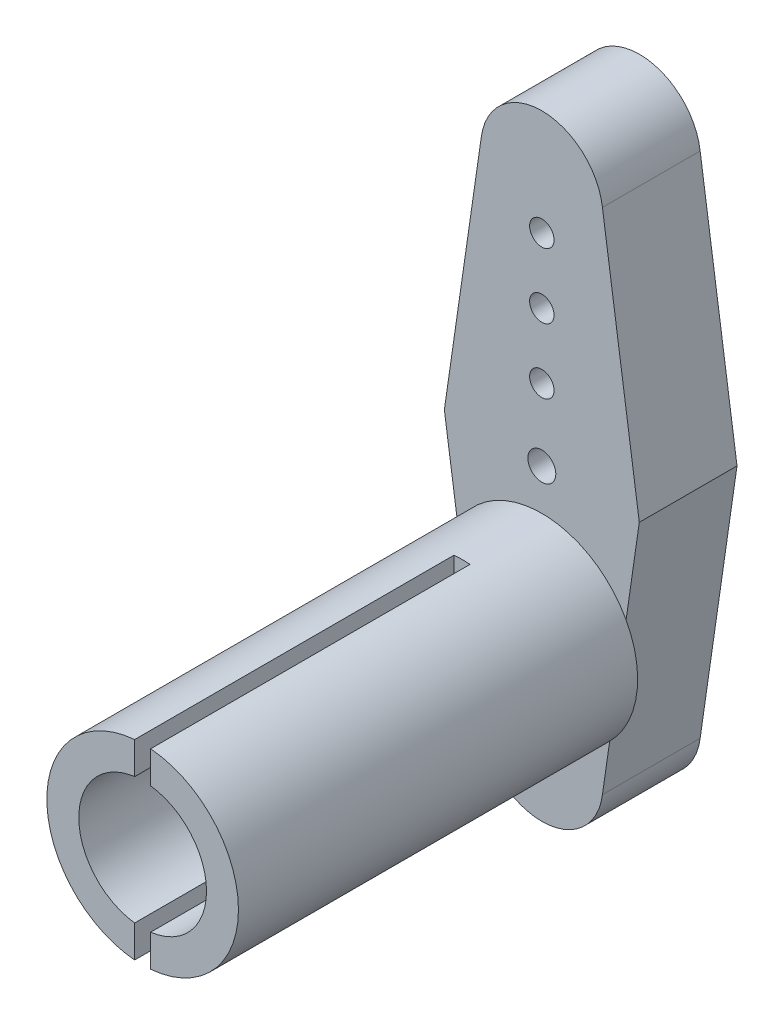
ISO-10303-21;
HEADER;
FILE_DESCRIPTION(('STEP AP214'),'2;1');
FILE_NAME('part.step','',(''),(''),'','','');
FILE_SCHEMA(('AUTOMOTIVE_DESIGN { 1 0 10303 214 1 1 1 1 }'));
ENDSEC;
DATA;
#1=APPLICATION_CONTEXT('core data for automotive mechanical design processes');
#2=APPLICATION_PROTOCOL_DEFINITION('international standard','automotive_design',2000,#1);
#3=PRODUCT_CONTEXT('',#1,'mechanical');
#4=PRODUCT('Part','Part','',(#3));
#5=PRODUCT_RELATED_PRODUCT_CATEGORY('part','',(#4));
#6=PRODUCT_DEFINITION_FORMATION('','',#4);
#7=PRODUCT_DEFINITION_CONTEXT('part definition',#1,'design');
#8=PRODUCT_DEFINITION('design','',#6,#7);
#9=PRODUCT_DEFINITION_SHAPE('','',#8);
#10=(LENGTH_UNIT() NAMED_UNIT(*) SI_UNIT(.MILLI.,.METRE.));
#11=(NAMED_UNIT(*) PLANE_ANGLE_UNIT() SI_UNIT($,.RADIAN.));
#12=(NAMED_UNIT(*) SI_UNIT($,.STERADIAN.) SOLID_ANGLE_UNIT());
#13=UNCERTAINTY_MEASURE_WITH_UNIT(LENGTH_MEASURE(1.E-05),#10,'distance_accuracy_value','');
#14=(GEOMETRIC_REPRESENTATION_CONTEXT(3) GLOBAL_UNCERTAINTY_ASSIGNED_CONTEXT((#13)) GLOBAL_UNIT_ASSIGNED_CONTEXT((#10,
#11,#12)) REPRESENTATION_CONTEXT('',''));
#15=CARTESIAN_POINT('',(0.,0.,0.));
#16=DIRECTION('',(0.,0.,1.));
#17=DIRECTION('',(1.,0.,0.));
#18=AXIS2_PLACEMENT_3D('',#15,#16,#17);
#19=CARTESIAN_POINT('',(-1.19664990586423E-09,-8.56204876477218,31.0513084455538));
#20=DIRECTION('',(0.,0.,1.));
#21=DIRECTION('',(1.,0.,0.));
#22=AXIS2_PLACEMENT_3D('',#19,#20,#21);
#23=PLANE('',#22);
#24=DIRECTION('',(0.,1.,0.));
#25=VECTOR('',#24,1.);
#26=CARTESIAN_POINT('',(0.499999999999995,-8.56204876477218,31.0513084455538));
#27=LINE('',#26,#25);
#28=CARTESIAN_POINT('',(0.499999999999995,-14.5411791362228,31.0513084455538));
#29=VERTEX_POINT('',#28);
#30=CARTESIAN_POINT('',(0.499999999999995,-12.5306757312183,31.0513084455538));
#31=VERTEX_POINT('',#30);
#32=EDGE_CURVE('E228',#29,#31,#27,.T.);
#33=ORIENTED_EDGE('',*,*,#32,.F.);
#34=CARTESIAN_POINT('',(-1.19664990586423E-09,-8.56204876477218,31.0513084455538));
#35=DIRECTION('',(0.,0.,1.));
#36=DIRECTION('',(1.,0.,0.));
#37=AXIS2_PLACEMENT_3D('',#34,#35,#36);
#38=CIRCLE('',#37,6.);
#39=CARTESIAN_POINT('',(0.499999999999995,-2.58291839332155,31.0513084455538));
#40=VERTEX_POINT('',#39);
#41=EDGE_CURVE('E225',#29,#40,#38,.T.);
#42=ORIENTED_EDGE('',*,*,#41,.T.);
#43=CARTESIAN_POINT('',(0.499999999999995,-4.59342179832606,31.0513084455538));
#44=VERTEX_POINT('',#43);
#45=EDGE_CURVE('E238',#44,#40,#27,.T.);
#46=ORIENTED_EDGE('',*,*,#45,.F.);
#47=CARTESIAN_POINT('',(-1.19664990586423E-09,-8.56204876477218,31.0513084455538));
#48=DIRECTION('',(0.,0.,1.));
#49=DIRECTION('',(1.,0.,0.));
#50=AXIS2_PLACEMENT_3D('',#47,#48,#49);
#51=CIRCLE('',#50,4.);
#52=EDGE_CURVE('E241',#31,#44,#51,.T.);
#53=ORIENTED_EDGE('',*,*,#52,.F.);
#54=EDGE_LOOP('',(#33,#42,#46,#53));
#55=FACE_BOUND('',#54,.T.);
#56=ADVANCED_FACE('F39',(#55),#23,.T.);
#57=CARTESIAN_POINT('',(-1.19664990586423E-09,0.107951235227818,6.05130844555376));
#58=DIRECTION('',(0.,0.,1.));
#59=DIRECTION('',(1.,0.,0.));
#60=AXIS2_PLACEMENT_3D('',#57,#58,#59);
#61=PLANE('',#60);
#62=CARTESIAN_POINT('',(-1.19664990586423E-09,-8.56204876477218,6.05130844555376));
#63=DIRECTION('',(0.,0.,1.));
#64=DIRECTION('',(1.,0.,0.));
#65=AXIS2_PLACEMENT_3D('',#62,#63,#64);
#66=CIRCLE('',#65,6.);
#67=CARTESIAN_POINT('',(5.27685124459652,-5.70638055404268,6.05130844555376));
#68=VERTEX_POINT('',#67);
#69=CARTESIAN_POINT('',(-5.27685118137984,-5.70638043280517,6.05130844555376));
#70=VERTEX_POINT('',#69);
#71=EDGE_CURVE('E252',#68,#70,#66,.T.);
#72=ORIENTED_EDGE('',*,*,#71,.F.);
#73=DIRECTION('',(0.143511087190295,0.989648709317331,0.));
#74=VECTOR('',#73,1.);
#75=CARTESIAN_POINT('',(6.11999999880335,0.107951235227818,6.05130844555376));
#76=LINE('',#75,#74);
#77=CARTESIAN_POINT('',(6.10434575807608,0.,6.05130844555376));
#78=VERTEX_POINT('',#77);
#79=EDGE_CURVE('E411',#68,#78,#76,.T.);
#80=ORIENTED_EDGE('',*,*,#79,.T.);
#81=DIRECTION('',(0.143511087190295,-0.989648709317331,0.));
#82=VECTOR('',#81,1.);
#83=CARTESIAN_POINT('',(6.11999999880335,-0.107951235227818,6.05130844555376));
#84=LINE('',#83,#82);
#85=CARTESIAN_POINT('',(3.79498273594539,15.9253070891053,6.05130844555376));
#86=VERTEX_POINT('',#85);
#87=EDGE_CURVE('E329',#86,#78,#84,.T.);
#88=ORIENTED_EDGE('',*,*,#87,.F.);
#89=CARTESIAN_POINT('',(-1.19664990586423E-09,15.4470487647722,6.05130844555376));
#90=DIRECTION('',(0.,0.,-1.));
#91=DIRECTION('',(1.,0.,0.));
#92=AXIS2_PLACEMENT_3D('',#89,#90,#91);
#93=CIRCLE('',#92,3.825);
#94=CARTESIAN_POINT('',(-3.79498426071311,15.9252950088999,6.05130844555376));
#95=VERTEX_POINT('',#94);
#96=EDGE_CURVE('E325',#95,#86,#93,.T.);
#97=ORIENTED_EDGE('',*,*,#96,.F.);
#98=DIRECTION('',(0.143511101058466,0.989648707306278,0.));
#99=VECTOR('',#98,1.);
#100=CARTESIAN_POINT('',(-6.12000000119665,-0.107951235227818,6.05130844555376));
#101=LINE('',#100,#99);
#102=CARTESIAN_POINT('',(-6.10434575892483,0.,6.05130844555376));
#103=VERTEX_POINT('',#102);
#104=EDGE_CURVE('E321',#103,#95,#101,.T.);
#105=ORIENTED_EDGE('',*,*,#104,.F.);
#106=DIRECTION('',(0.143511101058466,-0.989648707306278,0.));
#107=VECTOR('',#106,1.);
#108=CARTESIAN_POINT('',(-6.12000000119665,0.107951235227818,6.05130844555376));
#109=LINE('',#108,#107);
#110=EDGE_CURVE('E402',#103,#70,#109,.T.);
#111=ORIENTED_EDGE('',*,*,#110,.T.);
#112=EDGE_LOOP('',(#72,#80,#88,#97,#105,#111));
#113=FACE_BOUND('',#112,.T.);
#114=CARTESIAN_POINT('',(0.,0.,6.05130844555376));
#115=DIRECTION('',(0.,0.,1.));
#116=DIRECTION('',(1.,0.,0.));
#117=AXIS2_PLACEMENT_3D('',#114,#115,#116);
#118=CIRCLE('',#117,0.875);
#119=CARTESIAN_POINT('',(0.875,0.,6.05130844555376));
#120=VERTEX_POINT('',#119);
#121=EDGE_CURVE('E259',#120,#120,#118,.T.);
#122=ORIENTED_EDGE('',*,*,#121,.F.);
#123=EDGE_LOOP('',(#122));
#124=FACE_BOUND('',#123,.T.);
#125=CARTESIAN_POINT('',(-1.19664990586423E-09,8.56204876477218,6.05130844555376));
#126=DIRECTION('',(0.,0.,1.));
#127=DIRECTION('',(-1.,0.,0.));
#128=AXIS2_PLACEMENT_3D('',#125,#126,#127);
#129=CIRCLE('',#128,0.765);
#130=CARTESIAN_POINT('',(-0.76500000119665,8.56204876477218,6.05130844555376));
#131=VERTEX_POINT('',#130);
#132=EDGE_CURVE('E278',#131,#131,#129,.T.);
#133=ORIENTED_EDGE('',*,*,#132,.F.);
#134=EDGE_LOOP('',(#133));
#135=FACE_BOUND('',#134,.T.);
#136=CARTESIAN_POINT('',(-1.19664990586423E-09,4.48204876477218,6.05130844555376));
#137=DIRECTION('',(0.,0.,1.));
#138=DIRECTION('',(-1.,0.,0.));
#139=AXIS2_PLACEMENT_3D('',#136,#137,#138);
#140=CIRCLE('',#139,0.765);
#141=CARTESIAN_POINT('',(-0.76500000119665,4.48204876477218,6.05130844555376));
#142=VERTEX_POINT('',#141);
#143=EDGE_CURVE('E286',#142,#142,#140,.T.);
#144=ORIENTED_EDGE('',*,*,#143,.F.);
#145=EDGE_LOOP('',(#144));
#146=FACE_BOUND('',#145,.T.);
#147=CARTESIAN_POINT('',(-1.19664990586423E-09,12.6420487647722,6.05130844555376));
#148=DIRECTION('',(0.,0.,1.));
#149=DIRECTION('',(-1.,0.,0.));
#150=AXIS2_PLACEMENT_3D('',#147,#148,#149);
#151=CIRCLE('',#150,0.765);
#152=CARTESIAN_POINT('',(-0.76500000119665,12.6420487647722,6.05130844555376));
#153=VERTEX_POINT('',#152);
#154=EDGE_CURVE('E349',#153,#153,#151,.T.);
#155=ORIENTED_EDGE('',*,*,#154,.F.);
#156=EDGE_LOOP('',(#155));
#157=FACE_BOUND('',#156,.T.);
#158=ADVANCED_FACE('F539',(#113,#124,#135,#146,#157),#61,.T.);
#159=CARTESIAN_POINT('',(-1.19664990586423E-09,-8.56204876477218,6.05130844555376));
#160=DIRECTION('',(0.,0.,-1.));
#161=DIRECTION('',(-1.,0.,0.));
#162=AXIS2_PLACEMENT_3D('',#159,#160,#161);
#163=CIRCLE('',#162,0.765);
#164=CARTESIAN_POINT('',(-0.76500000119665,-8.56204876477218,6.05130844555376));
#165=VERTEX_POINT('',#164);
#166=EDGE_CURVE('E360',#165,#165,#163,.T.);
#167=ORIENTED_EDGE('',*,*,#166,.T.);
#168=EDGE_LOOP('',(#167));
#169=FACE_BOUND('',#168,.T.);
#170=CARTESIAN_POINT('',(-1.19664990586423E-09,-4.48204876477218,6.05130844555376));
#171=DIRECTION('',(0.,0.,-1.));
#172=DIRECTION('',(-1.,0.,0.));
#173=AXIS2_PLACEMENT_3D('',#170,#171,#172);
#174=CIRCLE('',#173,0.765);
#175=CARTESIAN_POINT('',(0.749962528498331,-4.63298320104669,6.05130844555376));
#176=VERTEX_POINT('',#175);
#177=CARTESIAN_POINT('',(-0.749962530891631,-4.63298320104669,6.05130844555376));
#178=VERTEX_POINT('',#177);
#179=EDGE_CURVE('E369',#176,#178,#174,.T.);
#180=ORIENTED_EDGE('',*,*,#179,.T.);
#181=CARTESIAN_POINT('',(-1.19664990586423E-09,-8.56204876477218,6.05130844555376));
#182=DIRECTION('',(0.,0.,1.));
#183=DIRECTION('',(1.,0.,0.));
#184=AXIS2_PLACEMENT_3D('',#181,#182,#183);
#185=CIRCLE('',#184,4.);
#186=CARTESIAN_POINT('',(-0.749962530891631,-12.4911143284977,6.05130844555376));
#187=VERTEX_POINT('',#186);
#188=EDGE_CURVE('E235',#178,#187,#185,.T.);
#189=ORIENTED_EDGE('',*,*,#188,.T.);
#190=CARTESIAN_POINT('',(-1.19664990586423E-09,-12.6420487647722,6.05130844555376));
#191=DIRECTION('',(0.,0.,-1.));
#192=DIRECTION('',(-1.,0.,0.));
#193=AXIS2_PLACEMENT_3D('',#190,#191,#192);
#194=CIRCLE('',#193,0.765);
#195=CARTESIAN_POINT('',(0.749962528498332,-12.4911143284977,6.05130844555376));
#196=VERTEX_POINT('',#195);
#197=EDGE_CURVE('E436',#187,#196,#194,.T.);
#198=ORIENTED_EDGE('',*,*,#197,.T.);
#199=EDGE_CURVE('E248',#196,#176,#185,.T.);
#200=ORIENTED_EDGE('',*,*,#199,.T.);
#201=EDGE_LOOP('',(#180,#189,#198,#200));
#202=FACE_BOUND('',#201,.T.);
#203=ADVANCED_FACE('F513',(#169,#202),#61,.T.);
#204=CARTESIAN_POINT('',(-1.19664990586423E-09,0.107951235227818,-0.0686915544462373));
#205=DIRECTION('',(0.,0.,1.));
#206=DIRECTION('',(1.,0.,0.));
#207=AXIS2_PLACEMENT_3D('',#204,#205,#206);
#208=PLANE('',#207);
#209=DIRECTION('',(0.143511101058466,-0.989648707306278,0.));
#210=VECTOR('',#209,1.);
#211=CARTESIAN_POINT('',(-6.12000000119665,0.107951235227818,-0.0686915544462373));
#212=LINE('',#211,#210);
#213=CARTESIAN_POINT('',(-6.10434575892483,0.,-0.0686915544462373));
#214=VERTEX_POINT('',#213);
#215=CARTESIAN_POINT('',(-3.79498426071311,-15.9252950088999,-0.0686915544462373));
#216=VERTEX_POINT('',#215);
#217=EDGE_CURVE('E401',#214,#216,#212,.T.);
#218=ORIENTED_EDGE('',*,*,#217,.F.);
#219=DIRECTION('',(0.143511101058466,0.989648707306278,0.));
#220=VECTOR('',#219,1.);
#221=CARTESIAN_POINT('',(-6.12000000119665,-0.107951235227818,-0.0686915544462373));
#222=LINE('',#221,#220);
#223=CARTESIAN_POINT('',(-3.79498426071311,15.9252950088999,-0.0686915544462373));
#224=VERTEX_POINT('',#223);
#225=EDGE_CURVE('E320',#214,#224,#222,.T.);
#226=ORIENTED_EDGE('',*,*,#225,.T.);
#227=CARTESIAN_POINT('',(-1.19664990586423E-09,15.4470487647722,-0.0686915544462373));
#228=DIRECTION('',(0.,0.,-1.));
#229=DIRECTION('',(1.,0.,0.));
#230=AXIS2_PLACEMENT_3D('',#227,#228,#229);
#231=CIRCLE('',#230,3.825);
#232=CARTESIAN_POINT('',(3.79498273594539,15.9253070891053,-0.0686915544462373));
#233=VERTEX_POINT('',#232);
#234=EDGE_CURVE('E337',#224,#233,#231,.T.);
#235=ORIENTED_EDGE('',*,*,#234,.T.);
#236=DIRECTION('',(0.143511087190295,-0.989648709317331,0.));
#237=VECTOR('',#236,1.);
#238=CARTESIAN_POINT('',(6.11999999880335,-0.107951235227818,-0.0686915544462373));
#239=LINE('',#238,#237);
#240=CARTESIAN_POINT('',(6.10434575807608,0.,-0.0686915544462373));
#241=VERTEX_POINT('',#240);
#242=EDGE_CURVE('E326',#233,#241,#239,.T.);
#243=ORIENTED_EDGE('',*,*,#242,.T.);
#244=DIRECTION('',(0.143511087190295,0.989648709317331,0.));
#245=VECTOR('',#244,1.);
#246=CARTESIAN_POINT('',(6.11999999880335,0.107951235227818,-0.0686915544462373));
#247=LINE('',#246,#245);
#248=CARTESIAN_POINT('',(3.79498273594539,-15.9253070891053,-0.0686915544462373));
#249=VERTEX_POINT('',#248);
#250=EDGE_CURVE('E422',#249,#241,#247,.T.);
#251=ORIENTED_EDGE('',*,*,#250,.F.);
#252=CARTESIAN_POINT('',(-1.19664990586423E-09,-15.4470487647722,-0.0686915544462373));
#253=DIRECTION('',(0.,0.,1.));
#254=DIRECTION('',(1.,0.,0.));
#255=AXIS2_PLACEMENT_3D('',#252,#253,#254);
#256=CIRCLE('',#255,3.825);
#257=EDGE_CURVE('E419',#216,#249,#256,.T.);
#258=ORIENTED_EDGE('',*,*,#257,.F.);
#259=EDGE_LOOP('',(#218,#226,#235,#243,#251,#258));
#260=FACE_BOUND('',#259,.T.);
#261=DIRECTION('',(0.0995037190209989,0.995037190209989,0.));
#262=VECTOR('',#261,1.);
#263=CARTESIAN_POINT('',(2.29499999880335,-15.1920487647722,-0.0686915544462373));
#264=LINE('',#263,#262);
#265=CARTESIAN_POINT('',(2.29499999880335,-15.1920487647722,-0.0686915544462373));
#266=VERTEX_POINT('',#265);
#267=CARTESIAN_POINT('',(3.81420487528057,0.,-0.0686915544462373));
#268=VERTEX_POINT('',#267);
#269=EDGE_CURVE('E378',#266,#268,#264,.T.);
#270=ORIENTED_EDGE('',*,*,#269,.T.);
#271=DIRECTION('',(0.0995037190209989,-0.995037190209989,0.));
#272=VECTOR('',#271,1.);
#273=CARTESIAN_POINT('',(2.29499999880335,15.1920487647722,-0.0686915544462373));
#274=LINE('',#273,#272);
#275=CARTESIAN_POINT('',(2.29499999880335,15.1920487647722,-0.0686915544462373));
#276=VERTEX_POINT('',#275);
#277=EDGE_CURVE('E296',#276,#268,#274,.T.);
#278=ORIENTED_EDGE('',*,*,#277,.F.);
#279=CARTESIAN_POINT('',(-1.19664990586423E-09,15.1920487647722,-0.0686915544462373));
#280=DIRECTION('',(0.,0.,-1.));
#281=DIRECTION('',(1.,0.,0.));
#282=AXIS2_PLACEMENT_3D('',#279,#280,#281);
#283=CIRCLE('',#282,2.295);
#284=CARTESIAN_POINT('',(-2.29500000119665,15.1920487647722,-0.0686915544462373));
#285=VERTEX_POINT('',#284);
#286=EDGE_CURVE('E308',#285,#276,#283,.T.);
#287=ORIENTED_EDGE('',*,*,#286,.F.);
#288=DIRECTION('',(0.0995037190209989,0.995037190209989,0.));
#289=VECTOR('',#288,1.);
#290=CARTESIAN_POINT('',(-3.82500000119665,-0.107951235227818,-0.0686915544462373));
#291=LINE('',#290,#289);
#292=CARTESIAN_POINT('',(-3.81420487767387,0.,-0.0686915544462373));
#293=VERTEX_POINT('',#292);
#294=EDGE_CURVE('E304',#293,#285,#291,.T.);
#295=ORIENTED_EDGE('',*,*,#294,.F.);
#296=DIRECTION('',(0.0995037190209989,-0.995037190209989,0.));
#297=VECTOR('',#296,1.);
#298=CARTESIAN_POINT('',(-3.82500000119665,0.107951235227818,-0.0686915544462373));
#299=LINE('',#298,#297);
#300=CARTESIAN_POINT('',(-2.29500000119665,-15.1920487647722,-0.0686915544462373));
#301=VERTEX_POINT('',#300);
#302=EDGE_CURVE('E385',#293,#301,#299,.T.);
#303=ORIENTED_EDGE('',*,*,#302,.T.);
#304=CARTESIAN_POINT('',(-1.19664990586423E-09,-15.1920487647722,-0.0686915544462373));
#305=DIRECTION('',(0.,0.,1.));
#306=DIRECTION('',(1.,0.,0.));
#307=AXIS2_PLACEMENT_3D('',#304,#305,#306);
#308=CIRCLE('',#307,2.295);
#309=EDGE_CURVE('E388',#301,#266,#308,.T.);
#310=ORIENTED_EDGE('',*,*,#309,.T.);
#311=EDGE_LOOP('',(#270,#278,#287,#295,#303,#310));
#312=FACE_BOUND('',#311,.T.);
#313=ADVANCED_FACE('F609',(#260,#312),#208,.F.);
#314=CARTESIAN_POINT('',(-6.12000000119665,0.107951235227818,6.05130844555376));
#315=DIRECTION('',(0.989648707306278,0.143511101058466,0.));
#316=DIRECTION('',(-0.143511101058466,0.989648707306278,0.));
#317=AXIS2_PLACEMENT_3D('',#314,#315,#316);
#318=PLANE('',#317);
#319=DIRECTION('',(0.,0.,1.));
#320=VECTOR('',#319,1.);
#321=CARTESIAN_POINT('',(-6.10434575892483,0.,6.05130844555376));
#322=LINE('',#321,#320);
#323=EDGE_CURVE('E274',#214,#103,#322,.T.);
#324=ORIENTED_EDGE('',*,*,#323,.F.);
#325=ORIENTED_EDGE('',*,*,#217,.T.);
#326=DIRECTION('',(0.,0.,-1.));
#327=VECTOR('',#326,1.);
#328=CARTESIAN_POINT('',(-3.79498426071311,-15.9252950088999,6.05130844555376));
#329=LINE('',#328,#327);
#330=CARTESIAN_POINT('',(-3.79498426071311,-15.9252950088999,6.05130844555376));
#331=VERTEX_POINT('',#330);
#332=EDGE_CURVE('E428',#331,#216,#329,.T.);
#333=ORIENTED_EDGE('',*,*,#332,.F.);
#334=CARTESIAN_POINT('',(-4.24833720110658,-12.7989852802113,6.05130844555376));
#335=VERTEX_POINT('',#334);
#336=EDGE_CURVE('E408',#335,#331,#109,.T.);
#337=ORIENTED_EDGE('',*,*,#336,.F.);
#338=EDGE_CURVE('E407',#70,#335,#109,.T.);
#339=ORIENTED_EDGE('',*,*,#338,.F.);
#340=ORIENTED_EDGE('',*,*,#110,.F.);
#341=EDGE_LOOP('',(#324,#325,#333,#337,#339,#340));
#342=FACE_BOUND('',#341,.T.);
#343=ADVANCED_FACE('F590',(#342),#318,.F.);
#344=CARTESIAN_POINT('',(6.11999999880335,0.107951235227818,6.05130844555376));
#345=DIRECTION('',(-0.989648709317331,0.143511087190295,0.));
#346=DIRECTION('',(-0.143511087190295,-0.989648709317331,0.));
#347=AXIS2_PLACEMENT_3D('',#344,#345,#346);
#348=PLANE('',#347);
#349=DIRECTION('',(0.,0.,-1.));
#350=VECTOR('',#349,1.);
#351=CARTESIAN_POINT('',(6.10434575807609,0.,6.05130844555376));
#352=LINE('',#351,#350);
#353=EDGE_CURVE('E270',#78,#241,#352,.T.);
#354=ORIENTED_EDGE('',*,*,#353,.F.);
#355=ORIENTED_EDGE('',*,*,#79,.F.);
#356=CARTESIAN_POINT('',(4.24833741480467,-12.7989850635385,6.05130844555376));
#357=VERTEX_POINT('',#356);
#358=EDGE_CURVE('E416',#357,#68,#76,.T.);
#359=ORIENTED_EDGE('',*,*,#358,.F.);
#360=CARTESIAN_POINT('',(3.79498273594539,-15.9253070891053,6.05130844555376));
#361=VERTEX_POINT('',#360);
#362=EDGE_CURVE('E412',#361,#357,#76,.T.);
#363=ORIENTED_EDGE('',*,*,#362,.F.);
#364=DIRECTION('',(0.,0.,-1.));
#365=VECTOR('',#364,1.);
#366=CARTESIAN_POINT('',(3.79498273594539,-15.9253070891053,6.05130844555376));
#367=LINE('',#366,#365);
#368=EDGE_CURVE('E415',#361,#249,#367,.T.);
#369=ORIENTED_EDGE('',*,*,#368,.T.);
#370=ORIENTED_EDGE('',*,*,#250,.T.);
#371=EDGE_LOOP('',(#354,#355,#359,#363,#369,#370));
#372=FACE_BOUND('',#371,.T.);
#373=ADVANCED_FACE('F600',(#372),#348,.F.);
#374=EDGE_CURVE('E258',#335,#357,#66,.T.);
#375=ORIENTED_EDGE('',*,*,#374,.F.);
#376=ORIENTED_EDGE('',*,*,#336,.T.);
#377=CARTESIAN_POINT('',(-1.19664990586423E-09,-15.4470487647722,6.05130844555376));
#378=DIRECTION('',(0.,0.,1.));
#379=DIRECTION('',(1.,0.,0.));
#380=AXIS2_PLACEMENT_3D('',#377,#378,#379);
#381=CIRCLE('',#380,3.825);
#382=EDGE_CURVE('E406',#331,#361,#381,.T.);
#383=ORIENTED_EDGE('',*,*,#382,.T.);
#384=ORIENTED_EDGE('',*,*,#362,.T.);
#385=EDGE_LOOP('',(#375,#376,#383,#384));
#386=FACE_BOUND('',#385,.T.);
#387=ADVANCED_FACE('F546',(#386),#61,.T.);
#388=CARTESIAN_POINT('',(-3.82500000119665,0.107951235227818,4.72530844555376));
#389=DIRECTION('',(0.995037190209989,0.0995037190209989,0.));
#390=DIRECTION('',(-0.0995037190209989,0.995037190209989,0.));
#391=AXIS2_PLACEMENT_3D('',#388,#389,#390);
#392=PLANE('',#391);
#393=ORIENTED_EDGE('',*,*,#302,.F.);
#394=DIRECTION('',(0.,0.,1.));
#395=VECTOR('',#394,1.);
#396=CARTESIAN_POINT('',(-3.81420487767387,0.,4.72530844555376));
#397=LINE('',#396,#395);
#398=CARTESIAN_POINT('',(-3.81420487767387,0.,4.72530844555376));
#399=VERTEX_POINT('',#398);
#400=EDGE_CURVE('E264',#293,#399,#397,.T.);
#401=ORIENTED_EDGE('',*,*,#400,.T.);
#402=DIRECTION('',(0.0995037190209989,-0.995037190209989,0.));
#403=VECTOR('',#402,1.);
#404=CARTESIAN_POINT('',(-3.82500000119665,0.107951235227818,4.72530844555376));
#405=LINE('',#404,#403);
#406=CARTESIAN_POINT('',(-2.29500000119665,-15.1920487647722,4.72530844555376));
#407=VERTEX_POINT('',#406);
#408=EDGE_CURVE('E374',#399,#407,#405,.T.);
#409=ORIENTED_EDGE('',*,*,#408,.T.);
#410=DIRECTION('',(0.,0.,-1.));
#411=VECTOR('',#410,1.);
#412=CARTESIAN_POINT('',(-2.29500000119665,-15.1920487647722,4.72530844555376));
#413=LINE('',#412,#411);
#414=EDGE_CURVE('E397',#407,#301,#413,.T.);
#415=ORIENTED_EDGE('',*,*,#414,.T.);
#416=EDGE_LOOP('',(#393,#401,#409,#415));
#417=FACE_BOUND('',#416,.T.);
#418=ADVANCED_FACE('F653',(#417),#392,.T.);
#419=CARTESIAN_POINT('',(2.29499999880335,-15.1920487647722,4.72530844555376));
#420=DIRECTION('',(-0.995037190209989,0.0995037190209989,0.));
#421=DIRECTION('',(-0.0995037190209989,-0.995037190209989,0.));
#422=AXIS2_PLACEMENT_3D('',#419,#420,#421);
#423=PLANE('',#422);
#424=DIRECTION('',(0.0995037190209989,0.995037190209989,0.));
#425=VECTOR('',#424,1.);
#426=CARTESIAN_POINT('',(2.29499999880335,-15.1920487647722,4.72530844555376));
#427=LINE('',#426,#425);
#428=CARTESIAN_POINT('',(2.29499999880335,-15.1920487647722,4.72530844555376));
#429=VERTEX_POINT('',#428);
#430=CARTESIAN_POINT('',(3.81420487528057,0.,4.72530844555376));
#431=VERTEX_POINT('',#430);
#432=EDGE_CURVE('E381',#429,#431,#427,.T.);
#433=ORIENTED_EDGE('',*,*,#432,.T.);
#434=DIRECTION('',(0.,0.,-1.));
#435=VECTOR('',#434,1.);
#436=CARTESIAN_POINT('',(3.81420487528057,0.,4.72530844555376));
#437=LINE('',#436,#435);
#438=EDGE_CURVE('E267',#431,#268,#437,.T.);
#439=ORIENTED_EDGE('',*,*,#438,.T.);
#440=ORIENTED_EDGE('',*,*,#269,.F.);
#441=DIRECTION('',(0.,0.,-1.));
#442=VECTOR('',#441,1.);
#443=CARTESIAN_POINT('',(2.29499999880335,-15.1920487647722,4.72530844555376));
#444=LINE('',#443,#442);
#445=EDGE_CURVE('E384',#429,#266,#444,.T.);
#446=ORIENTED_EDGE('',*,*,#445,.F.);
#447=EDGE_LOOP('',(#433,#439,#440,#446));
#448=FACE_BOUND('',#447,.T.);
#449=ADVANCED_FACE('F649',(#448),#423,.T.);
#450=CARTESIAN_POINT('',(-1.19664990586423E-09,0.107951235227818,4.72530844555376));
#451=DIRECTION('',(0.,0.,1.));
#452=DIRECTION('',(1.,0.,0.));
#453=AXIS2_PLACEMENT_3D('',#450,#451,#452);
#454=PLANE('',#453);
#455=CARTESIAN_POINT('',(0.,0.,4.72530844555376));
#456=DIRECTION('',(0.,0.,1.));
#457=DIRECTION('',(1.,0.,0.));
#458=AXIS2_PLACEMENT_3D('',#455,#456,#457);
#459=CIRCLE('',#458,0.875);
#460=CARTESIAN_POINT('',(0.875,0.,4.72530844555376));
#461=VERTEX_POINT('',#460);
#462=EDGE_CURVE('E263',#461,#461,#459,.T.);
#463=ORIENTED_EDGE('',*,*,#462,.T.);
#464=EDGE_LOOP('',(#463));
#465=FACE_BOUND('',#464,.T.);
#466=ORIENTED_EDGE('',*,*,#408,.F.);
#467=DIRECTION('',(0.0995037190209989,0.995037190209989,0.));
#468=VECTOR('',#467,1.);
#469=CARTESIAN_POINT('',(-3.82500000119665,-0.107951235227818,4.72530844555376));
#470=LINE('',#469,#468);
#471=CARTESIAN_POINT('',(-2.29500000119665,15.1920487647722,4.72530844555376));
#472=VERTEX_POINT('',#471);
#473=EDGE_CURVE('E291',#399,#472,#470,.T.);
#474=ORIENTED_EDGE('',*,*,#473,.T.);
#475=CARTESIAN_POINT('',(-1.19664990586423E-09,15.1920487647722,4.72530844555376));
#476=DIRECTION('',(0.,0.,-1.));
#477=DIRECTION('',(1.,0.,0.));
#478=AXIS2_PLACEMENT_3D('',#475,#476,#477);
#479=CIRCLE('',#478,2.295);
#480=CARTESIAN_POINT('',(2.29499999880335,15.1920487647722,4.72530844555376));
#481=VERTEX_POINT('',#480);
#482=EDGE_CURVE('E295',#472,#481,#479,.T.);
#483=ORIENTED_EDGE('',*,*,#482,.T.);
#484=DIRECTION('',(0.0995037190209989,-0.995037190209989,0.));
#485=VECTOR('',#484,1.);
#486=CARTESIAN_POINT('',(2.29499999880335,15.1920487647722,4.72530844555376));
#487=LINE('',#486,#485);
#488=EDGE_CURVE('E299',#481,#431,#487,.T.);
#489=ORIENTED_EDGE('',*,*,#488,.T.);
#490=ORIENTED_EDGE('',*,*,#432,.F.);
#491=CARTESIAN_POINT('',(-1.19664990586423E-09,-15.1920487647722,4.72530844555376));
#492=DIRECTION('',(0.,0.,1.));
#493=DIRECTION('',(1.,0.,0.));
#494=AXIS2_PLACEMENT_3D('',#491,#492,#493);
#495=CIRCLE('',#494,2.295);
#496=EDGE_CURVE('E377',#407,#429,#495,.T.);
#497=ORIENTED_EDGE('',*,*,#496,.F.);
#498=EDGE_LOOP('',(#466,#474,#483,#489,#490,#497));
#499=FACE_BOUND('',#498,.T.);
#500=CARTESIAN_POINT('',(-1.19664990586423E-09,-12.6420487647722,4.72530844555376));
#501=DIRECTION('',(0.,0.,1.));
#502=DIRECTION('',(1.,0.,0.));
#503=AXIS2_PLACEMENT_3D('',#500,#501,#502);
#504=CIRCLE('',#503,0.765);
#505=CARTESIAN_POINT('',(0.76499999880335,-12.6420487647722,4.72530844555376));
#506=VERTEX_POINT('',#505);
#507=EDGE_CURVE('E440',#506,#506,#504,.T.);
#508=ORIENTED_EDGE('',*,*,#507,.T.);
#509=EDGE_LOOP('',(#508));
#510=FACE_BOUND('',#509,.T.);
#511=CARTESIAN_POINT('',(-1.19664990586423E-09,-4.48204876477218,4.72530844555376));
#512=DIRECTION('',(0.,0.,1.));
#513=DIRECTION('',(1.,0.,0.));
#514=AXIS2_PLACEMENT_3D('',#511,#512,#513);
#515=CIRCLE('',#514,0.765);
#516=CARTESIAN_POINT('',(0.76499999880335,-4.48204876477218,4.72530844555376));
#517=VERTEX_POINT('',#516);
#518=EDGE_CURVE('E373',#517,#517,#515,.T.);
#519=ORIENTED_EDGE('',*,*,#518,.T.);
#520=EDGE_LOOP('',(#519));
#521=FACE_BOUND('',#520,.T.);
#522=CARTESIAN_POINT('',(-1.19664990586423E-09,-8.56204876477218,4.72530844555376));
#523=DIRECTION('',(0.,0.,1.));
#524=DIRECTION('',(1.,0.,0.));
#525=AXIS2_PLACEMENT_3D('',#522,#523,#524);
#526=CIRCLE('',#525,0.765);
#527=CARTESIAN_POINT('',(0.76499999880335,-8.56204876477218,4.72530844555376));
#528=VERTEX_POINT('',#527);
#529=EDGE_CURVE('E364',#528,#528,#526,.T.);
#530=ORIENTED_EDGE('',*,*,#529,.T.);
#531=EDGE_LOOP('',(#530));
#532=FACE_BOUND('',#531,.T.);
#533=CARTESIAN_POINT('',(-1.19664990586423E-09,12.6420487647722,4.72530844555376));
#534=DIRECTION('',(0.,0.,-1.));
#535=DIRECTION('',(1.,0.,0.));
#536=AXIS2_PLACEMENT_3D('',#533,#534,#535);
#537=CIRCLE('',#536,0.765);
#538=CARTESIAN_POINT('',(0.76499999880335,12.6420487647722,4.72530844555376));
#539=VERTEX_POINT('',#538);
#540=EDGE_CURVE('E356',#539,#539,#537,.T.);
#541=ORIENTED_EDGE('',*,*,#540,.F.);
#542=EDGE_LOOP('',(#541));
#543=FACE_BOUND('',#542,.T.);
#544=CARTESIAN_POINT('',(-1.19664990586423E-09,4.48204876477218,4.72530844555376));
#545=DIRECTION('',(0.,0.,-1.));
#546=DIRECTION('',(1.,0.,0.));
#547=AXIS2_PLACEMENT_3D('',#544,#545,#546);
#548=CIRCLE('',#547,0.765);
#549=CARTESIAN_POINT('',(0.76499999880335,4.48204876477218,4.72530844555376));
#550=VERTEX_POINT('',#549);
#551=EDGE_CURVE('E290',#550,#550,#548,.T.);
#552=ORIENTED_EDGE('',*,*,#551,.F.);
#553=EDGE_LOOP('',(#552));
#554=FACE_BOUND('',#553,.T.);
#555=CARTESIAN_POINT('',(-1.19664990586423E-09,8.56204876477218,4.72530844555376));
#556=DIRECTION('',(0.,0.,-1.));
#557=DIRECTION('',(1.,0.,0.));
#558=AXIS2_PLACEMENT_3D('',#555,#556,#557);
#559=CIRCLE('',#558,0.765);
#560=CARTESIAN_POINT('',(0.76499999880335,8.56204876477218,4.72530844555376));
#561=VERTEX_POINT('',#560);
#562=EDGE_CURVE('E282',#561,#561,#559,.T.);
#563=ORIENTED_EDGE('',*,*,#562,.F.);
#564=EDGE_LOOP('',(#563));
#565=FACE_BOUND('',#564,.T.);
#566=ADVANCED_FACE('F646',(#465,#499,#510,#521,#532,#543,#554,#565),#454,.F.);
#567=CARTESIAN_POINT('',(-1.19664990586423E-09,-12.6420487647722,6.05130844555376));
#568=DIRECTION('',(0.,0.,-1.));
#569=DIRECTION('',(-1.,0.,0.));
#570=AXIS2_PLACEMENT_3D('',#567,#568,#569);
#571=CYLINDRICAL_SURFACE('',#570,0.765);
#572=ORIENTED_EDGE('',*,*,#197,.F.);
#573=EDGE_CURVE('E432',#196,#187,#194,.T.);
#574=ORIENTED_EDGE('',*,*,#573,.F.);
#575=EDGE_LOOP('',(#572,#574));
#576=FACE_BOUND('',#575,.T.);
#577=ORIENTED_EDGE('',*,*,#507,.F.);
#578=EDGE_LOOP('',(#577));
#579=FACE_BOUND('',#578,.T.);
#580=ADVANCED_FACE('F41',(#576,#579),#571,.F.);
#581=CARTESIAN_POINT('',(-1.19664990586423E-09,-15.4470487647722,6.05130844555376));
#582=DIRECTION('',(0.,0.,-1.));
#583=DIRECTION('',(-1.,0.,0.));
#584=AXIS2_PLACEMENT_3D('',#581,#582,#583);
#585=CYLINDRICAL_SURFACE('',#584,3.825);
#586=ORIENTED_EDGE('',*,*,#257,.T.);
#587=ORIENTED_EDGE('',*,*,#368,.F.);
#588=ORIENTED_EDGE('',*,*,#382,.F.);
#589=ORIENTED_EDGE('',*,*,#332,.T.);
#590=EDGE_LOOP('',(#586,#587,#588,#589));
#591=FACE_BOUND('',#590,.T.);
#592=ADVANCED_FACE('F594',(#591),#585,.T.);
#593=CARTESIAN_POINT('',(-1.19664990586423E-09,-15.1920487647722,4.72530844555376));
#594=DIRECTION('',(0.,0.,-1.));
#595=DIRECTION('',(-1.,0.,0.));
#596=AXIS2_PLACEMENT_3D('',#593,#594,#595);
#597=CYLINDRICAL_SURFACE('',#596,2.295);
#598=ORIENTED_EDGE('',*,*,#309,.F.);
#599=ORIENTED_EDGE('',*,*,#414,.F.);
#600=ORIENTED_EDGE('',*,*,#496,.T.);
#601=ORIENTED_EDGE('',*,*,#445,.T.);
#602=EDGE_LOOP('',(#598,#599,#600,#601));
#603=FACE_BOUND('',#602,.T.);
#604=ADVANCED_FACE('F645',(#603),#597,.F.);
#605=CARTESIAN_POINT('',(-1.19664990586423E-09,-4.48204876477218,6.05130844555376));
#606=DIRECTION('',(0.,0.,-1.));
#607=DIRECTION('',(-1.,0.,0.));
#608=AXIS2_PLACEMENT_3D('',#605,#606,#607);
#609=CYLINDRICAL_SURFACE('',#608,0.765);
#610=ORIENTED_EDGE('',*,*,#179,.F.);
#611=EDGE_CURVE('E368',#178,#176,#174,.T.);
#612=ORIENTED_EDGE('',*,*,#611,.F.);
#613=EDGE_LOOP('',(#610,#612));
#614=FACE_BOUND('',#613,.T.);
#615=ORIENTED_EDGE('',*,*,#518,.F.);
#616=EDGE_LOOP('',(#615));
#617=FACE_BOUND('',#616,.T.);
#618=ADVANCED_FACE('F517',(#614,#617),#609,.F.);
#619=CARTESIAN_POINT('',(-1.19664990586423E-09,-8.56204876477218,6.05130844555376));
#620=DIRECTION('',(0.,0.,-1.));
#621=DIRECTION('',(-1.,0.,0.));
#622=AXIS2_PLACEMENT_3D('',#619,#620,#621);
#623=CYLINDRICAL_SURFACE('',#622,0.765);
#624=ORIENTED_EDGE('',*,*,#166,.F.);
#625=EDGE_LOOP('',(#624));
#626=FACE_BOUND('',#625,.T.);
#627=ORIENTED_EDGE('',*,*,#529,.F.);
#628=EDGE_LOOP('',(#627));
#629=FACE_BOUND('',#628,.T.);
#630=ADVANCED_FACE('F629',(#626,#629),#623,.F.);
#631=CARTESIAN_POINT('',(-6.12000000119665,-0.107951235227818,6.05130844555376));
#632=DIRECTION('',(0.989648707306278,-0.143511101058466,0.));
#633=DIRECTION('',(-0.143511101058466,-0.989648707306278,0.));
#634=AXIS2_PLACEMENT_3D('',#631,#632,#633);
#635=PLANE('',#634);
#636=ORIENTED_EDGE('',*,*,#323,.T.);
#637=ORIENTED_EDGE('',*,*,#104,.T.);
#638=DIRECTION('',(0.,0.,-1.));
#639=VECTOR('',#638,1.);
#640=CARTESIAN_POINT('',(-3.79498426071311,15.9252950088999,6.05130844555376));
#641=LINE('',#640,#639);
#642=EDGE_CURVE('E346',#95,#224,#641,.T.);
#643=ORIENTED_EDGE('',*,*,#642,.T.);
#644=ORIENTED_EDGE('',*,*,#225,.F.);
#645=EDGE_LOOP('',(#636,#637,#643,#644));
#646=FACE_BOUND('',#645,.T.);
#647=ADVANCED_FACE('F611',(#646),#635,.F.);
#648=CARTESIAN_POINT('',(6.11999999880335,-0.107951235227818,6.05130844555376));
#649=DIRECTION('',(-0.989648709317331,-0.143511087190295,0.));
#650=DIRECTION('',(-0.143511087190295,0.989648709317331,0.));
#651=AXIS2_PLACEMENT_3D('',#648,#649,#650);
#652=PLANE('',#651);
#653=ORIENTED_EDGE('',*,*,#353,.T.);
#654=ORIENTED_EDGE('',*,*,#242,.F.);
#655=DIRECTION('',(0.,0.,-1.));
#656=VECTOR('',#655,1.);
#657=CARTESIAN_POINT('',(3.79498273594539,15.9253070891053,6.05130844555376));
#658=LINE('',#657,#656);
#659=EDGE_CURVE('E333',#86,#233,#658,.T.);
#660=ORIENTED_EDGE('',*,*,#659,.F.);
#661=ORIENTED_EDGE('',*,*,#87,.T.);
#662=EDGE_LOOP('',(#653,#654,#660,#661));
#663=FACE_BOUND('',#662,.T.);
#664=ADVANCED_FACE('F618',(#663),#652,.F.);
#665=CARTESIAN_POINT('',(-3.82500000119665,-0.107951235227818,4.72530844555376));
#666=DIRECTION('',(0.995037190209989,-0.0995037190209989,0.));
#667=DIRECTION('',(-0.0995037190209989,-0.995037190209989,0.));
#668=AXIS2_PLACEMENT_3D('',#665,#666,#667);
#669=PLANE('',#668);
#670=ORIENTED_EDGE('',*,*,#294,.T.);
#671=DIRECTION('',(0.,0.,-1.));
#672=VECTOR('',#671,1.);
#673=CARTESIAN_POINT('',(-2.29500000119665,15.1920487647722,4.72530844555376));
#674=LINE('',#673,#672);
#675=EDGE_CURVE('E317',#472,#285,#674,.T.);
#676=ORIENTED_EDGE('',*,*,#675,.F.);
#677=ORIENTED_EDGE('',*,*,#473,.F.);
#678=ORIENTED_EDGE('',*,*,#400,.F.);
#679=EDGE_LOOP('',(#670,#676,#677,#678));
#680=FACE_BOUND('',#679,.T.);
#681=ADVANCED_FACE('F620',(#680),#669,.T.);
#682=CARTESIAN_POINT('',(2.29499999880335,15.1920487647722,4.72530844555376));
#683=DIRECTION('',(-0.995037190209989,-0.0995037190209989,0.));
#684=DIRECTION('',(-0.0995037190209989,0.995037190209989,0.));
#685=AXIS2_PLACEMENT_3D('',#682,#683,#684);
#686=PLANE('',#685);
#687=ORIENTED_EDGE('',*,*,#488,.F.);
#688=DIRECTION('',(0.,0.,-1.));
#689=VECTOR('',#688,1.);
#690=CARTESIAN_POINT('',(2.29499999880335,15.1920487647722,4.72530844555376));
#691=LINE('',#690,#689);
#692=EDGE_CURVE('E303',#481,#276,#691,.T.);
#693=ORIENTED_EDGE('',*,*,#692,.T.);
#694=ORIENTED_EDGE('',*,*,#277,.T.);
#695=ORIENTED_EDGE('',*,*,#438,.F.);
#696=EDGE_LOOP('',(#687,#693,#694,#695));
#697=FACE_BOUND('',#696,.T.);
#698=ADVANCED_FACE('F626',(#697),#686,.T.);
#699=CARTESIAN_POINT('',(-1.19664990586423E-09,12.6420487647722,6.05130844555376));
#700=DIRECTION('',(0.,0.,-1.));
#701=DIRECTION('',(-1.,0.,0.));
#702=AXIS2_PLACEMENT_3D('',#699,#700,#701);
#703=CYLINDRICAL_SURFACE('',#702,0.765);
#704=ORIENTED_EDGE('',*,*,#154,.T.);
#705=EDGE_LOOP('',(#704));
#706=FACE_BOUND('',#705,.T.);
#707=ORIENTED_EDGE('',*,*,#540,.T.);
#708=EDGE_LOOP('',(#707));
#709=FACE_BOUND('',#708,.T.);
#710=ADVANCED_FACE('F635',(#706,#709),#703,.F.);
#711=CARTESIAN_POINT('',(-1.19664990586423E-09,15.4470487647722,6.05130844555376));
#712=DIRECTION('',(0.,0.,-1.));
#713=DIRECTION('',(-1.,0.,0.));
#714=AXIS2_PLACEMENT_3D('',#711,#712,#713);
#715=CYLINDRICAL_SURFACE('',#714,3.825);
#716=ORIENTED_EDGE('',*,*,#234,.F.);
#717=ORIENTED_EDGE('',*,*,#642,.F.);
#718=ORIENTED_EDGE('',*,*,#96,.T.);
#719=ORIENTED_EDGE('',*,*,#659,.T.);
#720=EDGE_LOOP('',(#716,#717,#718,#719));
#721=FACE_BOUND('',#720,.T.);
#722=ADVANCED_FACE('F615',(#721),#715,.T.);
#723=CARTESIAN_POINT('',(-1.19664990586423E-09,15.1920487647722,4.72530844555376));
#724=DIRECTION('',(0.,0.,-1.));
#725=DIRECTION('',(-1.,0.,0.));
#726=AXIS2_PLACEMENT_3D('',#723,#724,#725);
#727=CYLINDRICAL_SURFACE('',#726,2.295);
#728=ORIENTED_EDGE('',*,*,#286,.T.);
#729=ORIENTED_EDGE('',*,*,#692,.F.);
#730=ORIENTED_EDGE('',*,*,#482,.F.);
#731=ORIENTED_EDGE('',*,*,#675,.T.);
#732=EDGE_LOOP('',(#728,#729,#730,#731));
#733=FACE_BOUND('',#732,.T.);
#734=ADVANCED_FACE('F634',(#733),#727,.F.);
#735=CARTESIAN_POINT('',(-1.19664990586423E-09,4.48204876477218,6.05130844555376));
#736=DIRECTION('',(0.,0.,-1.));
#737=DIRECTION('',(-1.,0.,0.));
#738=AXIS2_PLACEMENT_3D('',#735,#736,#737);
#739=CYLINDRICAL_SURFACE('',#738,0.765);
#740=ORIENTED_EDGE('',*,*,#143,.T.);
#741=EDGE_LOOP('',(#740));
#742=FACE_BOUND('',#741,.T.);
#743=ORIENTED_EDGE('',*,*,#551,.T.);
#744=EDGE_LOOP('',(#743));
#745=FACE_BOUND('',#744,.T.);
#746=ADVANCED_FACE('F765',(#742,#745),#739,.F.);
#747=CARTESIAN_POINT('',(-1.19664990586423E-09,8.56204876477218,6.05130844555376));
#748=DIRECTION('',(0.,0.,-1.));
#749=DIRECTION('',(-1.,0.,0.));
#750=AXIS2_PLACEMENT_3D('',#747,#748,#749);
#751=CYLINDRICAL_SURFACE('',#750,0.765);
#752=ORIENTED_EDGE('',*,*,#132,.T.);
#753=EDGE_LOOP('',(#752));
#754=FACE_BOUND('',#753,.T.);
#755=ORIENTED_EDGE('',*,*,#562,.T.);
#756=EDGE_LOOP('',(#755));
#757=FACE_BOUND('',#756,.T.);
#758=ADVANCED_FACE('F571',(#754,#757),#751,.F.);
#759=CARTESIAN_POINT('',(0.,0.,-0.0686915544462373));
#760=DIRECTION('',(0.,0.,1.));
#761=DIRECTION('',(1.,0.,0.));
#762=AXIS2_PLACEMENT_3D('',#759,#760,#761);
#763=CYLINDRICAL_SURFACE('',#762,0.875);
#764=ORIENTED_EDGE('',*,*,#121,.T.);
#765=EDGE_LOOP('',(#764));
#766=FACE_BOUND('',#765,.T.);
#767=ORIENTED_EDGE('',*,*,#462,.F.);
#768=EDGE_LOOP('',(#767));
#769=FACE_BOUND('',#768,.T.);
#770=ADVANCED_FACE('F565',(#766,#769),#763,.F.);
#771=CARTESIAN_POINT('',(-1.19664990586423E-09,-8.56204876477218,6.05130844555376));
#772=DIRECTION('',(0.,0.,1.));
#773=DIRECTION('',(1.,0.,0.));
#774=AXIS2_PLACEMENT_3D('',#771,#772,#773);
#775=PLANE('',#774);
#776=EDGE_CURVE('E233',#176,#178,#185,.T.);
#777=ORIENTED_EDGE('',*,*,#776,.T.);
#778=ORIENTED_EDGE('',*,*,#611,.T.);
#779=EDGE_LOOP('',(#777,#778));
#780=FACE_BOUND('',#779,.T.);
#781=ADVANCED_FACE('F558',(#780),#775,.F.);
#782=EDGE_CURVE('E227',#187,#196,#185,.T.);
#783=ORIENTED_EDGE('',*,*,#782,.T.);
#784=ORIENTED_EDGE('',*,*,#573,.T.);
#785=EDGE_LOOP('',(#783,#784));
#786=FACE_BOUND('',#785,.T.);
#787=ADVANCED_FACE('F562',(#786),#775,.F.);
#788=EDGE_CURVE('E257',#357,#68,#66,.T.);
#789=ORIENTED_EDGE('',*,*,#788,.F.);
#790=ORIENTED_EDGE('',*,*,#358,.T.);
#791=EDGE_LOOP('',(#789,#790));
#792=FACE_BOUND('',#791,.T.);
#793=ADVANCED_FACE('F556',(#792),#775,.F.);
#794=EDGE_CURVE('E256',#70,#335,#66,.T.);
#795=ORIENTED_EDGE('',*,*,#794,.F.);
#796=ORIENTED_EDGE('',*,*,#338,.T.);
#797=EDGE_LOOP('',(#795,#796));
#798=FACE_BOUND('',#797,.T.);
#799=ADVANCED_FACE('F550',(#798),#775,.F.);
#800=DIRECTION('',(0.,-1.,0.));
#801=VECTOR('',#800,1.);
#802=CARTESIAN_POINT('',(-0.500000000000005,-8.56204876477218,31.0513084455538));
#803=LINE('',#802,#801);
#804=CARTESIAN_POINT('',(-0.500000000000005,-2.58291839312141,31.0513084455538));
#805=VERTEX_POINT('',#804);
#806=CARTESIAN_POINT('',(-0.500000000000005,-4.59342179802453,31.0513084455538));
#807=VERTEX_POINT('',#806);
#808=EDGE_CURVE('E478',#805,#807,#803,.T.);
#809=ORIENTED_EDGE('',*,*,#808,.F.);
#810=CARTESIAN_POINT('',(-0.500000000000005,-14.541179136423,31.0513084455538));
#811=VERTEX_POINT('',#810);
#812=EDGE_CURVE('E251',#805,#811,#38,.T.);
#813=ORIENTED_EDGE('',*,*,#812,.T.);
#814=CARTESIAN_POINT('',(-0.500000000000005,-12.5306757315198,31.0513084455538));
#815=VERTEX_POINT('',#814);
#816=EDGE_CURVE('E484',#815,#811,#803,.T.);
#817=ORIENTED_EDGE('',*,*,#816,.F.);
#818=EDGE_CURVE('E244',#807,#815,#51,.T.);
#819=ORIENTED_EDGE('',*,*,#818,.F.);
#820=EDGE_LOOP('',(#809,#813,#817,#819));
#821=FACE_BOUND('',#820,.T.);
#822=ADVANCED_FACE('F525',(#821),#23,.T.);
#823=CARTESIAN_POINT('',(-1.19664990586423E-09,-8.56204876477218,31.0513084455538));
#824=DIRECTION('',(0.,0.,-1.));
#825=DIRECTION('',(-1.,0.,0.));
#826=AXIS2_PLACEMENT_3D('',#823,#824,#825);
#827=CYLINDRICAL_SURFACE('',#826,6.);
#828=CARTESIAN_POINT('',(-1.19664990586423E-09,-8.56204876477218,11.0513084455538));
#829=DIRECTION('',(0.,0.,-1.));
#830=DIRECTION('',(-1.,0.,0.));
#831=AXIS2_PLACEMENT_3D('',#828,#829,#830);
#832=CIRCLE('',#831,6.);
#833=CARTESIAN_POINT('',(-0.500000000000004,-2.58291839312141,11.0513084455538));
#834=VERTEX_POINT('',#833);
#835=CARTESIAN_POINT('',(0.499999999999996,-2.58291839332155,11.0513084455538));
#836=VERTEX_POINT('',#835);
#837=EDGE_CURVE('E207',#834,#836,#832,.T.);
#838=ORIENTED_EDGE('',*,*,#837,.T.);
#839=DIRECTION('',(0.,0.,-1.));
#840=VECTOR('',#839,1.);
#841=CARTESIAN_POINT('',(0.499999999999995,-2.58291839332155,31.0513084455538));
#842=LINE('',#841,#840);
#843=EDGE_CURVE('E236',#836,#40,#842,.F.);
#844=ORIENTED_EDGE('',*,*,#843,.T.);
#845=ORIENTED_EDGE('',*,*,#41,.F.);
#846=DIRECTION('',(0.,0.,-1.));
#847=VECTOR('',#846,1.);
#848=CARTESIAN_POINT('',(0.499999999999995,-14.5411791362228,31.0513084455538));
#849=LINE('',#848,#847);
#850=CARTESIAN_POINT('',(0.499999999999996,-14.5411791362228,11.0513084455538));
#851=VERTEX_POINT('',#850);
#852=EDGE_CURVE('E211',#29,#851,#849,.T.);
#853=ORIENTED_EDGE('',*,*,#852,.T.);
#854=CARTESIAN_POINT('',(-0.500000000000004,-14.541179136423,11.0513084455538));
#855=VERTEX_POINT('',#854);
#856=EDGE_CURVE('E199',#851,#855,#832,.T.);
#857=ORIENTED_EDGE('',*,*,#856,.T.);
#858=DIRECTION('',(0.,0.,-1.));
#859=VECTOR('',#858,1.);
#860=CARTESIAN_POINT('',(-0.500000000000005,-14.541179136423,31.0513084455538));
#861=LINE('',#860,#859);
#862=EDGE_CURVE('E481',#855,#811,#861,.F.);
#863=ORIENTED_EDGE('',*,*,#862,.T.);
#864=ORIENTED_EDGE('',*,*,#812,.F.);
#865=DIRECTION('',(0.,0.,-1.));
#866=VECTOR('',#865,1.);
#867=CARTESIAN_POINT('',(-0.500000000000005,-2.58291839312141,31.0513084455538));
#868=LINE('',#867,#866);
#869=EDGE_CURVE('E474',#805,#834,#868,.T.);
#870=ORIENTED_EDGE('',*,*,#869,.T.);
#871=EDGE_LOOP('',(#838,#844,#845,#853,#857,#863,#864,#870));
#872=FACE_BOUND('',#871,.T.);
#873=ORIENTED_EDGE('',*,*,#71,.T.);
#874=ORIENTED_EDGE('',*,*,#794,.T.);
#875=ORIENTED_EDGE('',*,*,#374,.T.);
#876=ORIENTED_EDGE('',*,*,#788,.T.);
#877=EDGE_LOOP('',(#873,#874,#875,#876));
#878=FACE_BOUND('',#877,.T.);
#879=ADVANCED_FACE('F221',(#872,#878),#827,.T.);
#880=CARTESIAN_POINT('',(-1.19664990586423E-09,-8.56204876477218,31.0513084455538));
#881=DIRECTION('',(0.,0.,-1.));
#882=DIRECTION('',(-1.,0.,0.));
#883=AXIS2_PLACEMENT_3D('',#880,#881,#882);
#884=CYLINDRICAL_SURFACE('',#883,4.);
#885=DIRECTION('',(0.,0.,-1.));
#886=VECTOR('',#885,1.);
#887=CARTESIAN_POINT('',(0.499999999999995,-4.59342179832606,31.0513084455538));
#888=LINE('',#887,#886);
#889=CARTESIAN_POINT('',(0.499999999999996,-4.59342179832606,11.0513084455538));
#890=VERTEX_POINT('',#889);
#891=EDGE_CURVE('E11',#890,#44,#888,.F.);
#892=ORIENTED_EDGE('',*,*,#891,.F.);
#893=CARTESIAN_POINT('',(-1.19664990586423E-09,-8.56204876477218,11.0513084455538));
#894=DIRECTION('',(0.,0.,-1.));
#895=DIRECTION('',(-1.,0.,0.));
#896=AXIS2_PLACEMENT_3D('',#893,#894,#895);
#897=CIRCLE('',#896,4.);
#898=CARTESIAN_POINT('',(-0.500000000000004,-4.59342179802453,11.0513084455538));
#899=VERTEX_POINT('',#898);
#900=EDGE_CURVE('E451',#899,#890,#897,.T.);
#901=ORIENTED_EDGE('',*,*,#900,.F.);
#902=DIRECTION('',(0.,0.,-1.));
#903=VECTOR('',#902,1.);
#904=CARTESIAN_POINT('',(-0.500000000000005,-4.59342179802453,31.0513084455538));
#905=LINE('',#904,#903);
#906=EDGE_CURVE('E48',#807,#899,#905,.T.);
#907=ORIENTED_EDGE('',*,*,#906,.F.);
#908=ORIENTED_EDGE('',*,*,#818,.T.);
#909=DIRECTION('',(0.,0.,-1.));
#910=VECTOR('',#909,1.);
#911=CARTESIAN_POINT('',(-0.500000000000005,-12.5306757315198,31.0513084455538));
#912=LINE('',#911,#910);
#913=CARTESIAN_POINT('',(-0.500000000000004,-12.5306757315198,11.0513084455538));
#914=VERTEX_POINT('',#913);
#915=EDGE_CURVE('E450',#914,#815,#912,.F.);
#916=ORIENTED_EDGE('',*,*,#915,.F.);
#917=CARTESIAN_POINT('',(0.499999999999996,-12.5306757312183,11.0513084455538));
#918=VERTEX_POINT('',#917);
#919=EDGE_CURVE('E447',#918,#914,#897,.T.);
#920=ORIENTED_EDGE('',*,*,#919,.F.);
#921=DIRECTION('',(0.,0.,-1.));
#922=VECTOR('',#921,1.);
#923=CARTESIAN_POINT('',(0.499999999999995,-12.5306757312183,31.0513084455538));
#924=LINE('',#923,#922);
#925=EDGE_CURVE('E214',#31,#918,#924,.T.);
#926=ORIENTED_EDGE('',*,*,#925,.F.);
#927=ORIENTED_EDGE('',*,*,#52,.T.);
#928=EDGE_LOOP('',(#892,#901,#907,#908,#916,#920,#926,#927));
#929=FACE_BOUND('',#928,.T.);
#930=ORIENTED_EDGE('',*,*,#776,.F.);
#931=ORIENTED_EDGE('',*,*,#199,.F.);
#932=ORIENTED_EDGE('',*,*,#782,.F.);
#933=ORIENTED_EDGE('',*,*,#188,.F.);
#934=EDGE_LOOP('',(#930,#931,#932,#933));
#935=FACE_BOUND('',#934,.T.);
#936=ADVANCED_FACE('F469',(#929,#935),#884,.F.);
#937=CARTESIAN_POINT('',(-0.500000000000004,-19.2720487647722,11.0513084455538));
#938=DIRECTION('',(0.,0.,-1.));
#939=DIRECTION('',(-1.,0.,0.));
#940=AXIS2_PLACEMENT_3D('',#937,#938,#939);
#941=PLANE('',#940);
#942=DIRECTION('',(0.,1.,0.));
#943=VECTOR('',#942,1.);
#944=CARTESIAN_POINT('',(0.499999999999996,-19.2720487647722,11.0513084455538));
#945=LINE('',#944,#943);
#946=EDGE_CURVE('E63',#851,#918,#945,.T.);
#947=ORIENTED_EDGE('',*,*,#946,.T.);
#948=ORIENTED_EDGE('',*,*,#919,.T.);
#949=DIRECTION('',(0.,1.,0.));
#950=VECTOR('',#949,1.);
#951=CARTESIAN_POINT('',(-0.500000000000004,-19.2720487647722,11.0513084455538));
#952=LINE('',#951,#950);
#953=EDGE_CURVE('E202',#855,#914,#952,.T.);
#954=ORIENTED_EDGE('',*,*,#953,.F.);
#955=ORIENTED_EDGE('',*,*,#856,.F.);
#956=EDGE_LOOP('',(#947,#948,#954,#955));
#957=FACE_BOUND('',#956,.T.);
#958=ADVANCED_FACE('F200',(#957),#941,.F.);
#959=CARTESIAN_POINT('',(-0.500000000000007,-19.2720487647722,51.0513084455538));
#960=DIRECTION('',(-1.,0.,0.));
#961=DIRECTION('',(0.,0.,1.));
#962=AXIS2_PLACEMENT_3D('',#959,#960,#961);
#963=PLANE('',#962);
#964=ORIENTED_EDGE('',*,*,#953,.T.);
#965=ORIENTED_EDGE('',*,*,#915,.T.);
#966=ORIENTED_EDGE('',*,*,#816,.T.);
#967=ORIENTED_EDGE('',*,*,#862,.F.);
#968=EDGE_LOOP('',(#964,#965,#966,#967));
#969=FACE_BOUND('',#968,.T.);
#970=ADVANCED_FACE('F491',(#969),#963,.F.);
#971=CARTESIAN_POINT('',(0.499999999999993,-19.2720487647722,51.0513084455538));
#972=DIRECTION('',(1.,0.,0.));
#973=DIRECTION('',(0.,0.,-1.));
#974=AXIS2_PLACEMENT_3D('',#971,#972,#973);
#975=PLANE('',#974);
#976=ORIENTED_EDGE('',*,*,#32,.T.);
#977=ORIENTED_EDGE('',*,*,#925,.T.);
#978=ORIENTED_EDGE('',*,*,#946,.F.);
#979=ORIENTED_EDGE('',*,*,#852,.F.);
#980=EDGE_LOOP('',(#976,#977,#978,#979));
#981=FACE_BOUND('',#980,.T.);
#982=ADVANCED_FACE('F210',(#981),#975,.F.);
#983=EDGE_CURVE('E217',#890,#836,#945,.T.);
#984=ORIENTED_EDGE('',*,*,#983,.F.);
#985=ORIENTED_EDGE('',*,*,#891,.T.);
#986=ORIENTED_EDGE('',*,*,#45,.T.);
#987=ORIENTED_EDGE('',*,*,#843,.F.);
#988=EDGE_LOOP('',(#984,#985,#986,#987));
#989=FACE_BOUND('',#988,.T.);
#990=ADVANCED_FACE('F466',(#989),#975,.F.);
#991=ORIENTED_EDGE('',*,*,#808,.T.);
#992=ORIENTED_EDGE('',*,*,#906,.T.);
#993=EDGE_CURVE('E55',#899,#834,#952,.T.);
#994=ORIENTED_EDGE('',*,*,#993,.T.);
#995=ORIENTED_EDGE('',*,*,#869,.F.);
#996=EDGE_LOOP('',(#991,#992,#994,#995));
#997=FACE_BOUND('',#996,.T.);
#998=ADVANCED_FACE('F526',(#997),#963,.F.);
#999=ORIENTED_EDGE('',*,*,#993,.F.);
#1000=ORIENTED_EDGE('',*,*,#900,.T.);
#1001=ORIENTED_EDGE('',*,*,#983,.T.);
#1002=ORIENTED_EDGE('',*,*,#837,.F.);
#1003=EDGE_LOOP('',(#999,#1000,#1001,#1002));
#1004=FACE_BOUND('',#1003,.T.);
#1005=ADVANCED_FACE('F462',(#1004),#941,.F.);
#1006=CLOSED_SHELL('',(#56,#158,#203,#313,#343,#373,#387,#418,#449,#566,#580,#592,#604,#618,
#630,#647,#664,#681,#698,#710,#722,#734,#746,#758,#770,#781,#787,#793,#799,#822,#879,#936,#958,
#970,#982,#990,#998,#1005));
#1007=MANIFOLD_SOLID_BREP('B2',#1006);
#1008=ADVANCED_BREP_SHAPE_REPRESENTATION('',(#18,#1007),#14);
#1009=SHAPE_DEFINITION_REPRESENTATION(#9,#1008);
ENDSEC;
END-ISO-10303-21;
